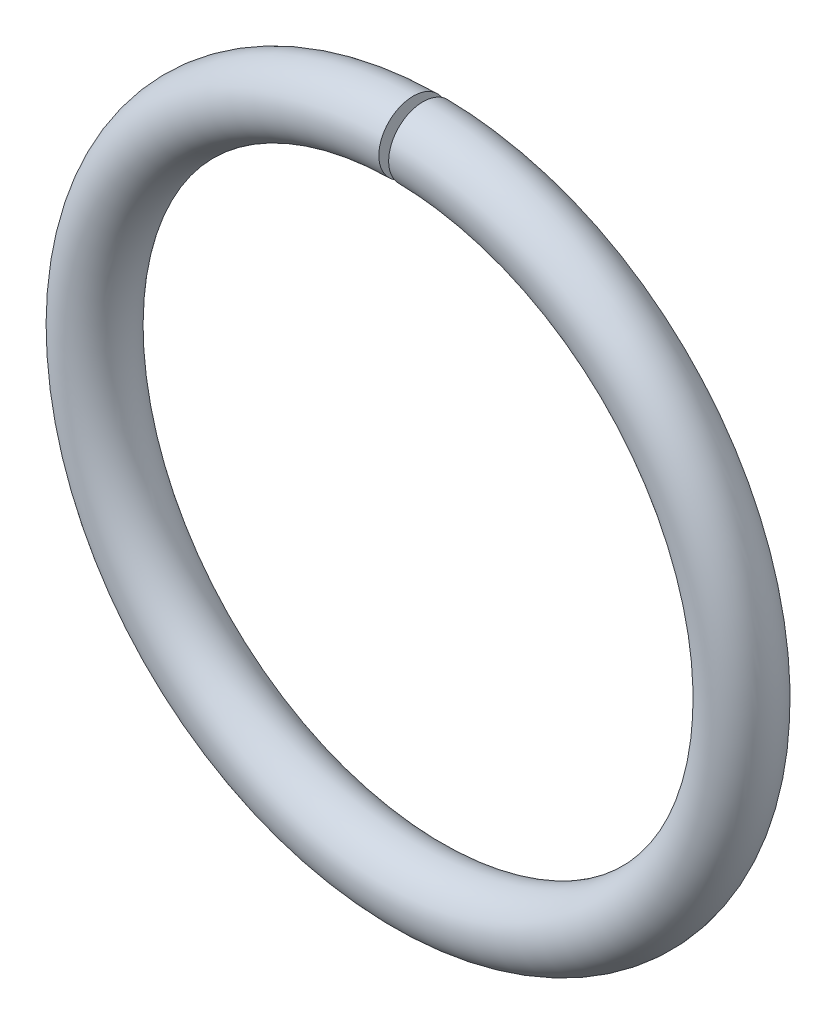
ISO-10303-21;
HEADER;
FILE_DESCRIPTION(('STEP AP214'),'2;1');
FILE_NAME('part.step','',(''),(''),'','','');
FILE_SCHEMA(('AUTOMOTIVE_DESIGN { 1 0 10303 214 1 1 1 1 }'));
ENDSEC;
DATA;
#1=APPLICATION_CONTEXT('core data for automotive mechanical design processes');
#2=APPLICATION_PROTOCOL_DEFINITION('international standard','automotive_design',2000,#1);
#3=PRODUCT_CONTEXT('',#1,'mechanical');
#4=PRODUCT('Part','Part','',(#3));
#5=PRODUCT_RELATED_PRODUCT_CATEGORY('part','',(#4));
#6=PRODUCT_DEFINITION_FORMATION('','',#4);
#7=PRODUCT_DEFINITION_CONTEXT('part definition',#1,'design');
#8=PRODUCT_DEFINITION('design','',#6,#7);
#9=PRODUCT_DEFINITION_SHAPE('','',#8);
#10=(LENGTH_UNIT() NAMED_UNIT(*) SI_UNIT(.MILLI.,.METRE.));
#11=(NAMED_UNIT(*) PLANE_ANGLE_UNIT() SI_UNIT($,.RADIAN.));
#12=(NAMED_UNIT(*) SI_UNIT($,.STERADIAN.) SOLID_ANGLE_UNIT());
#13=UNCERTAINTY_MEASURE_WITH_UNIT(LENGTH_MEASURE(1.E-05),#10,'distance_accuracy_value','');
#14=(GEOMETRIC_REPRESENTATION_CONTEXT(3) GLOBAL_UNCERTAINTY_ASSIGNED_CONTEXT((#13)) GLOBAL_UNIT_ASSIGNED_CONTEXT((#10,
#11,#12)) REPRESENTATION_CONTEXT('',''));
#15=CARTESIAN_POINT('',(0.,0.,0.));
#16=DIRECTION('',(0.,0.,1.));
#17=DIRECTION('',(1.,0.,0.));
#18=AXIS2_PLACEMENT_3D('',#15,#16,#17);
#19=CARTESIAN_POINT('',(0.,0.,0.));
#20=DIRECTION('',(0.,0.,1.));
#21=DIRECTION('',(1.,0.,0.));
#22=AXIS2_PLACEMENT_3D('',#19,#20,#21);
#23=TOROIDAL_SURFACE('',#22,6.6,0.7);
#24=CARTESIAN_POINT('',(0.1,5.97104543502459,-0.308980130475582));
#25=CARTESIAN_POINT('',(0.1,5.98840535740072,-0.344261740612456));
#26=CARTESIAN_POINT('',(0.1,6.00875776823187,-0.378102894239922));
#27=CARTESIAN_POINT('',(0.1,6.05487308222002,-0.441915442569126));
#28=CARTESIAN_POINT('',(0.1,6.08064247990334,-0.471882121804383));
#29=CARTESIAN_POINT('',(0.1,6.13683716920066,-0.527051127007278));
#30=CARTESIAN_POINT('',(0.1,6.16726020625305,-0.552255746916887));
#31=CARTESIAN_POINT('',(0.1,6.23189745684606,-0.597192955625521));
#32=CARTESIAN_POINT('',(0.1,6.26611072668791,-0.616926902255768));
#33=CARTESIAN_POINT('',(0.1,6.33737128835972,-0.650376077057763));
#34=CARTESIAN_POINT('',(0.1,6.37441914051928,-0.664090111607459));
#35=CARTESIAN_POINT('',(0.1,6.45029272416017,-0.685104769879625));
#36=CARTESIAN_POINT('',(0.1,6.48911852633607,-0.692405138349538));
#37=CARTESIAN_POINT('',(0.1,6.56744713259649,-0.700384738953389));
#38=CARTESIAN_POINT('',(0.1,6.6069499786683,-0.701063558948589));
#39=CARTESIAN_POINT('',(0.1,6.68550888153946,-0.695779625447748));
#40=CARTESIAN_POINT('',(0.1,6.72456493918053,-0.689816884465954));
#41=CARTESIAN_POINT('',(0.1,6.8011217981669,-0.671418896151319));
#42=CARTESIAN_POINT('',(0.1,6.8386225922731,-0.658983618695107));
#43=CARTESIAN_POINT('',(0.1,6.91100393559579,-0.627993339867831));
#44=CARTESIAN_POINT('',(0.1,6.94588449024696,-0.609438351190175));
#45=CARTESIAN_POINT('',(0.1,7.01203281701252,-0.566736553760894));
#46=CARTESIAN_POINT('',(0.1,7.04330082135962,-0.542590104756306));
#47=CARTESIAN_POINT('',(0.1,7.10133871752061,-0.489389984625644));
#48=CARTESIAN_POINT('',(0.1,7.12810860680424,-0.460336310739177));
#49=CARTESIAN_POINT('',(0.1,7.17638752379237,-0.398149545396633));
#50=CARTESIAN_POINT('',(0.1,7.19789706545059,-0.365016852950357));
#51=CARTESIAN_POINT('',(0.1,7.23504774808372,-0.295610350288607));
#52=CARTESIAN_POINT('',(0.1,7.25068889446804,-0.259336542968606));
#53=CARTESIAN_POINT('',(0.1,7.27565736784412,-0.184681046708042));
#54=CARTESIAN_POINT('',(0.1,7.28498526726877,-0.146299549216616));
#55=CARTESIAN_POINT('',(0.1,7.29706458359254,-0.0685152735416863));
#56=CARTESIAN_POINT('',(0.1,7.29981600200903,-0.0291124955938204));
#57=CARTESIAN_POINT('',(0.1,7.29866423641471,0.0495935651471423));
#58=CARTESIAN_POINT('',(0.1,7.29476140796075,0.0888968531439125));
#59=CARTESIAN_POINT('',(0.1,7.28041268115254,0.166290336820413));
#60=CARTESIAN_POINT('',(0.1,7.26996678371749,0.204380532670564));
#61=CARTESIAN_POINT('',(0.1,7.24282858168654,0.278266636459367));
#62=CARTESIAN_POINT('',(0.1,7.22613627484334,0.314062543572585));
#63=CARTESIAN_POINT('',(0.1,7.18697927354563,0.382344093366013));
#64=CARTESIAN_POINT('',(0.1,7.16451457766005,0.414829735225556));
#65=CARTESIAN_POINT('',(0.1,7.11444929031052,0.475570529331845));
#66=CARTESIAN_POINT('',(0.1,7.08684842132358,0.503825452831112));
#67=CARTESIAN_POINT('',(0.1,7.02729522496229,0.555300979508496));
#68=CARTESIAN_POINT('',(0.1,6.99534289620505,0.578521581086693));
#69=CARTESIAN_POINT('',(0.1,6.92799071845446,0.619271589184228));
#70=CARTESIAN_POINT('',(0.1,6.89259055598238,0.636800477581128));
#71=CARTESIAN_POINT('',(0.1,6.81935002087189,0.665666943341454));
#72=CARTESIAN_POINT('',(0.1,6.78150964588931,0.677004514757183));
#73=CARTESIAN_POINT('',(0.1,6.70445891783322,0.69316760298769));
#74=CARTESIAN_POINT('',(0.1,6.66524843139051,0.697992484023321));
#75=CARTESIAN_POINT('',(0.1,6.58657398113138,0.700991341993812));
#76=CARTESIAN_POINT('',(0.1,6.5471100174681,0.699165322946782));
#77=CARTESIAN_POINT('',(0.1,6.46904617898765,0.688913937381113));
#78=CARTESIAN_POINT('',(0.1,6.43044635936138,0.680488150580294));
#79=CARTESIAN_POINT('',(0.1,6.35520908007549,0.657275781774264));
#80=CARTESIAN_POINT('',(0.1,6.31857162419099,0.642489187532926));
#81=CARTESIAN_POINT('',(0.1,6.24829949775138,0.606974855654768));
#82=CARTESIAN_POINT('',(0.1,6.21466481017589,0.586247151696319));
#83=CARTESIAN_POINT('',(0.1,6.15135301250768,0.539438681079769));
#84=CARTESIAN_POINT('',(0.1,6.12167590899812,0.513357905517386));
#85=CARTESIAN_POINT('',(0.1,6.06712399730618,0.456585346313804));
#86=CARTESIAN_POINT('',(0.1,6.04224888557618,0.425893854347404));
#87=CARTESIAN_POINT('',(0.1,5.99800619904873,0.360771003254004));
#88=CARTESIAN_POINT('',(0.1,5.97863840411937,0.326339793682585));
#89=CARTESIAN_POINT('',(0.1,5.94596307895047,0.254722783746134));
#90=CARTESIAN_POINT('',(0.1,5.93265412846764,0.217537631306722));
#91=CARTESIAN_POINT('',(0.1,5.91246586111982,0.141450250992602));
#92=CARTESIAN_POINT('',(0.1,5.90558813898398,0.10254759973874));
#93=CARTESIAN_POINT('',(0.1,5.89846050195636,0.0241291918620494));
#94=CARTESIAN_POINT('',(0.1,5.89821300535159,-0.0153867832046126));
#95=CARTESIAN_POINT('',(0.1,5.90436195720161,-0.0938654960645597));
#96=CARTESIAN_POINT('',(0.1,5.91075040953843,-0.132828842477172));
#97=CARTESIAN_POINT('',(0.1,5.92634917466374,-0.194769513805028));
#98=CARTESIAN_POINT('',(0.1,5.93360051691383,-0.218258206371246));
#99=CARTESIAN_POINT('',(0.1,5.95052725175926,-0.264345288035065));
#100=CARTESIAN_POINT('',(0.1,5.96020264420424,-0.286943677187891));
#101=CARTESIAN_POINT('',(0.1,5.97104543502459,-0.308980130475582));
#102=B_SPLINE_CURVE_WITH_KNOTS('',3,(#24,#25,#26,#27,#28,#29,#30,#31,#32,#33,#34,#35,#36,#37,
#38,#39,#40,#41,#42,#43,#44,#45,#46,#47,#48,#49,#50,#51,#52,#53,#54,#55,#56,#57,#58,#59,#60,#61,
#62,#63,#64,#65,#66,#67,#68,#69,#70,#71,#72,#73,#74,#75,#76,#77,#78,#79,#80,#81,#82,#83,#84,#85,
#86,#87,#88,#89,#90,#91,#92,#93,#94,#95,#96,#97,#98,#99,#100,#101),.UNSPECIFIED.,.T.,.F.,(4,2,2,
2,2,2,2,2,2,2,2,2,2,2,2,2,2,2,2,2,2,2,2,2,2,2,2,2,2,2,2,2,2,2,2,2,2,2,4),(0.,0.117874024191181,
0.235890184093546,0.353849348415273,0.471779208787855,0.589732441622798,0.707690368574953,
0.825655637423179,0.943620683997742,1.06158627958995,1.1795516305013,1.29750939378833,
1.41546722342871,1.53341352358278,1.65135971501537,1.76929521063228,1.8872306790383,
2.00515984598765,2.12308899636967,2.24101818917971,2.35894741122615,2.47688300719698,
2.59481864064798,2.71276500689179,2.83071148644076,2.94866947927929,3.06662740085405,
3.18459283476033,3.3025584955948,3.4205234877305,3.53848867609038,3.65644640508992,
3.77439941856076,3.89232476861453,4.010279352456,4.12827695808523,4.24613254491831,
4.31975519362878,4.39337783777241),.UNSPECIFIED.);
#103=CARTESIAN_POINT('',(0.1,5.97104543502459,-0.308980130475582));
#104=VERTEX_POINT('',#103);
#105=EDGE_CURVE('E41',#104,#104,#102,.T.);
#106=ORIENTED_EDGE('',*,*,#105,.T.);
#107=EDGE_LOOP('',(#106));
#108=FACE_BOUND('',#107,.T.);
#109=CARTESIAN_POINT('',(-0.0999999999999999,5.97104543502459,-0.308980130475582));
#110=CARTESIAN_POINT('',(-0.0999999999999999,5.95369148365277,-0.273702755564059));
#111=CARTESIAN_POINT('',(-0.0999999999999999,5.93930386998433,-0.23693424188819));
#112=CARTESIAN_POINT('',(-0.0999999999999999,5.91689467269473,-0.161472772473979));
#113=CARTESIAN_POINT('',(-0.0999999999999999,5.90888076800837,-0.122777554907023));
#114=CARTESIAN_POINT('',(-0.0999999999999999,5.89946777912786,-0.0446057051503436));
#115=CARTESIAN_POINT('',(-0.0999999999999999,5.89806555583668,-0.00512945272268207));
#116=CARTESIAN_POINT('',(-0.0999999999999999,5.9019094958358,0.0734872483015998));
#117=CARTESIAN_POINT('',(-0.0999999999999999,5.90715400871132,0.112627777830542));
#118=CARTESIAN_POINT('',(-0.0999999999999999,5.92413954641296,0.189476328490841));
#119=CARTESIAN_POINT('',(-0.0999999999999999,5.93588108121851,0.227184236921216));
#120=CARTESIAN_POINT('',(-0.0999999999999999,5.96552823875483,0.300095203103786));
#121=CARTESIAN_POINT('',(-0.0999999999999999,5.98343410443512,0.335298162064541));
#122=CARTESIAN_POINT('',(-0.0999999999999999,6.02490206447246,0.402200122788258));
#123=CARTESIAN_POINT('',(-0.0999999999999999,6.04846439843795,0.433898976033925));
#124=CARTESIAN_POINT('',(-0.0999999999999999,6.10057575470119,0.492891550287389));
#125=CARTESIAN_POINT('',(-0.0999999999999999,6.12912477024587,0.52018527726061));
#126=CARTESIAN_POINT('',(-0.0999999999999999,6.19040298201649,0.569596619797841));
#127=CARTESIAN_POINT('',(-0.0999999999999999,6.22313271135777,0.591713574210762));
#128=CARTESIAN_POINT('',(-0.0999999999999999,6.29184032353737,0.630139455989508));
#129=CARTESIAN_POINT('',(-0.0999999999999999,6.32781820280751,0.646448389735525));
#130=CARTESIAN_POINT('',(-0.0999999999999999,6.40200557138905,0.672797287930092));
#131=CARTESIAN_POINT('',(-0.0999999999999999,6.44021533094769,0.68283649148046));
#132=CARTESIAN_POINT('',(-0.0999999999999999,6.51777796563265,0.696357975955179));
#133=CARTESIAN_POINT('',(-0.0999999999999999,6.55713084244162,0.699840247227378));
#134=CARTESIAN_POINT('',(-0.0999999999999999,6.63586503550729,0.700148995260471));
#135=CARTESIAN_POINT('',(-0.0999999999999999,6.67524635330589,0.696975079047733));
#136=CARTESIAN_POINT('',(-0.0999999999999999,6.75291713580169,0.684060613926102));
#137=CARTESIAN_POINT('',(-0.0999999999999999,6.79120660094279,0.674320067686919));
#138=CARTESIAN_POINT('',(-0.0999999999999999,6.86560592139398,0.64854888641797));
#139=CARTESIAN_POINT('',(-0.0999999999999999,6.90171581849881,0.632518372046968));
#140=CARTESIAN_POINT('',(-0.0999999999999999,6.97073150187052,0.59462207638521));
#141=CARTESIAN_POINT('',(-0.0999999999999999,7.00363728885281,0.572756296397351));
#142=CARTESIAN_POINT('',(-0.0999999999999999,7.06530784808707,0.523811950120597));
#143=CARTESIAN_POINT('',(-0.0999999999999999,7.09407294440719,0.496733792162784));
#144=CARTESIAN_POINT('',(-0.0999999999999999,7.14664826668647,0.43813213756389));
#145=CARTESIAN_POINT('',(-0.0999999999999999,7.17045849545489,0.406608643443185));
#146=CARTESIAN_POINT('',(-0.0999999999999999,7.21244568458626,0.340014538547026));
#147=CARTESIAN_POINT('',(-0.0999999999999999,7.2306232043963,0.304944280499429));
#148=CARTESIAN_POINT('',(-0.0999999999999999,7.26083188782347,0.232249608614251));
#149=CARTESIAN_POINT('',(-0.0999999999999999,7.27286305415919,0.194625195906407));
#150=CARTESIAN_POINT('',(-0.0999999999999999,7.29043655034911,0.11789360204176));
#151=CARTESIAN_POINT('',(-0.0999999999999999,7.29597941573001,0.0787865435336079));
#152=CARTESIAN_POINT('',(-0.0999999999999999,7.30042067517744,0.0001969434396281));
#153=CARTESIAN_POINT('',(-0.0999999999999999,7.29931907205669,-0.0392855979872433));
#154=CARTESIAN_POINT('',(-0.0999999999999999,7.29050286290037,-0.117503755865388));
#155=CARTESIAN_POINT('',(-0.0999999999999999,7.28278851438788,-0.156239401343298));
#156=CARTESIAN_POINT('',(-0.0999999999999999,7.26096625037437,-0.23186581442711));
#157=CARTESIAN_POINT('',(-0.0999999999999999,7.24685833234136,-0.268756581302395));
#158=CARTESIAN_POINT('',(-0.0999999999999999,7.21264928063311,-0.339646732915687));
#159=CARTESIAN_POINT('',(-0.0999999999999999,7.19254804535764,-0.373646068624857));
#160=CARTESIAN_POINT('',(-0.0999999999999999,7.1469232628836,-0.437787716934921));
#161=CARTESIAN_POINT('',(-0.0999999999999999,7.12139971987391,-0.467930032515423));
#162=CARTESIAN_POINT('',(-0.0999999999999999,7.06565308813103,-0.523504250445365));
#163=CARTESIAN_POINT('',(-0.0999999999999999,7.03542968570485,-0.548935838127936));
#164=CARTESIAN_POINT('',(-0.0999999999999999,6.97114255212944,-0.594364600548558));
#165=CARTESIAN_POINT('',(-0.0999999999999999,6.93707881214762,-0.614361762787329));
#166=CARTESIAN_POINT('',(-0.0999999999999999,6.86607457162312,-0.64835598750025));
#167=CARTESIAN_POINT('',(-0.0999999999999999,6.82913379884541,-0.662352481352838));
#168=CARTESIAN_POINT('',(-0.0999999999999999,6.75342681164071,-0.683945646652454));
#169=CARTESIAN_POINT('',(-0.0999999999999999,6.71466059254585,-0.691542301733477));
#170=CARTESIAN_POINT('',(-0.0999999999999999,6.63639871345674,-0.700120836909724));
#171=CARTESIAN_POINT('',(-0.0999999999999999,6.59690297336565,-0.701101986282784));
#172=CARTESIAN_POINT('',(-0.0999999999999999,6.51830882325736,-0.696419825834449));
#173=CARTESIAN_POINT('',(-0.0999999999999999,6.47921039785512,-0.690756774290071));
#174=CARTESIAN_POINT('',(-0.0999999999999999,6.40252144917867,-0.672948175671174));
#175=CARTESIAN_POINT('',(-0.0999999999999999,6.36493083961376,-0.660803000132431));
#176=CARTESIAN_POINT('',(-0.0999999999999999,6.29231225946766,-0.630369950401487));
#177=CARTESIAN_POINT('',(-0.0999999999999999,6.25728492806897,-0.612080550390706));
#178=CARTESIAN_POINT('',(-0.0999999999999999,6.19078574630795,-0.569873663974919));
#179=CARTESIAN_POINT('',(-0.0999999999999999,6.15931550522872,-0.545953645156001));
#180=CARTESIAN_POINT('',(-0.0999999999999999,6.10086854679273,-0.493185115118324));
#181=CARTESIAN_POINT('',(-0.0999999999999999,6.073886467443,-0.464342569556274));
#182=CARTESIAN_POINT('',(-0.0999999999999999,6.03430745246839,-0.414166953175493));
#183=CARTESIAN_POINT('',(-0.0999999999999999,6.02011043744538,-0.394073799240928));
#184=CARTESIAN_POINT('',(-0.0999999999999999,5.99390427124833,-0.352508089791803));
#185=CARTESIAN_POINT('',(-0.0999999999999999,5.98189512002863,-0.331035534306025));
#186=CARTESIAN_POINT('',(-0.0999999999999999,5.97104543502459,-0.308980130475582));
#187=B_SPLINE_CURVE_WITH_KNOTS('',3,(#109,#110,#111,#112,#113,#114,#115,#116,#117,#118,#119,
#120,#121,#122,#123,#124,#125,#126,#127,#128,#129,#130,#131,#132,#133,#134,#135,#136,#137,#138,
#139,#140,#141,#142,#143,#144,#145,#146,#147,#148,#149,#150,#151,#152,#153,#154,#155,#156,#157,
#158,#159,#160,#161,#162,#163,#164,#165,#166,#167,#168,#169,#170,#171,#172,#173,#174,#175,#176,
#177,#178,#179,#180,#181,#182,#183,#184,#185,#186),.UNSPECIFIED.,.T.,.F.,(4,2,2,2,2,2,2,2,2,2,2,
2,2,2,2,2,2,2,2,2,2,2,2,2,2,2,2,2,2,2,2,2,2,2,2,2,2,2,4),(0.,0.117854666491674,
0.235851108073351,0.35379152160701,0.471702655737077,0.589623046536895,0.707548085364948,
0.825478120388743,0.943407995710301,1.06135292422828,1.17929772318174,1.297256833206,
1.41521611687223,1.53318236491458,1.65114856499696,1.76911250227617,1.88707641321646,
2.00503108677159,2.12298569345012,2.24092858098441,2.35887141635137,2.47680451635129,
2.59473756642787,2.71266602399389,2.83059452826211,2.94852503179807,3.06645544423037,
3.18439373133149,3.30233228969053,3.42028202140365,3.53823205474313,3.65619511615572,
3.77415359219552,3.89210530793758,4.01008633675604,4.1281205301739,4.24601267961791,
4.31969538201661,4.39337808287786),.UNSPECIFIED.);
#188=CARTESIAN_POINT('',(-0.0999999999999999,5.97104543502459,-0.308980130475582));
#189=VERTEX_POINT('',#188);
#190=EDGE_CURVE('E10',#189,#189,#187,.T.);
#191=ORIENTED_EDGE('',*,*,#190,.T.);
#192=EDGE_LOOP('',(#191));
#193=FACE_BOUND('',#192,.T.);
#194=ADVANCED_FACE('F32',(#108,#193),#23,.T.);
#195=CARTESIAN_POINT('',(0.1,7.65777644859966,-0.7));
#196=DIRECTION('',(1.,0.,0.));
#197=DIRECTION('',(0.,0.,-1.));
#198=AXIS2_PLACEMENT_3D('',#195,#196,#197);
#199=PLANE('',#198);
#200=ORIENTED_EDGE('',*,*,#105,.F.);
#201=EDGE_LOOP('',(#200));
#202=FACE_BOUND('',#201,.T.);
#203=ADVANCED_FACE('F50',(#202),#199,.F.);
#204=CARTESIAN_POINT('',(-0.0999999999999999,7.65777644859966,-0.7));
#205=DIRECTION('',(-1.,0.,0.));
#206=DIRECTION('',(0.,-1.,0.));
#207=AXIS2_PLACEMENT_3D('',#204,#205,#206);
#208=PLANE('',#207);
#209=ORIENTED_EDGE('',*,*,#190,.F.);
#210=EDGE_LOOP('',(#209));
#211=FACE_BOUND('',#210,.T.);
#212=ADVANCED_FACE('F53',(#211),#208,.F.);
#213=CLOSED_SHELL('',(#194,#203,#212));
#214=MANIFOLD_SOLID_BREP('B2',#213);
#215=ADVANCED_BREP_SHAPE_REPRESENTATION('',(#18,#214),#14);
#216=SHAPE_DEFINITION_REPRESENTATION(#9,#215);
ENDSEC;
END-ISO-10303-21;
